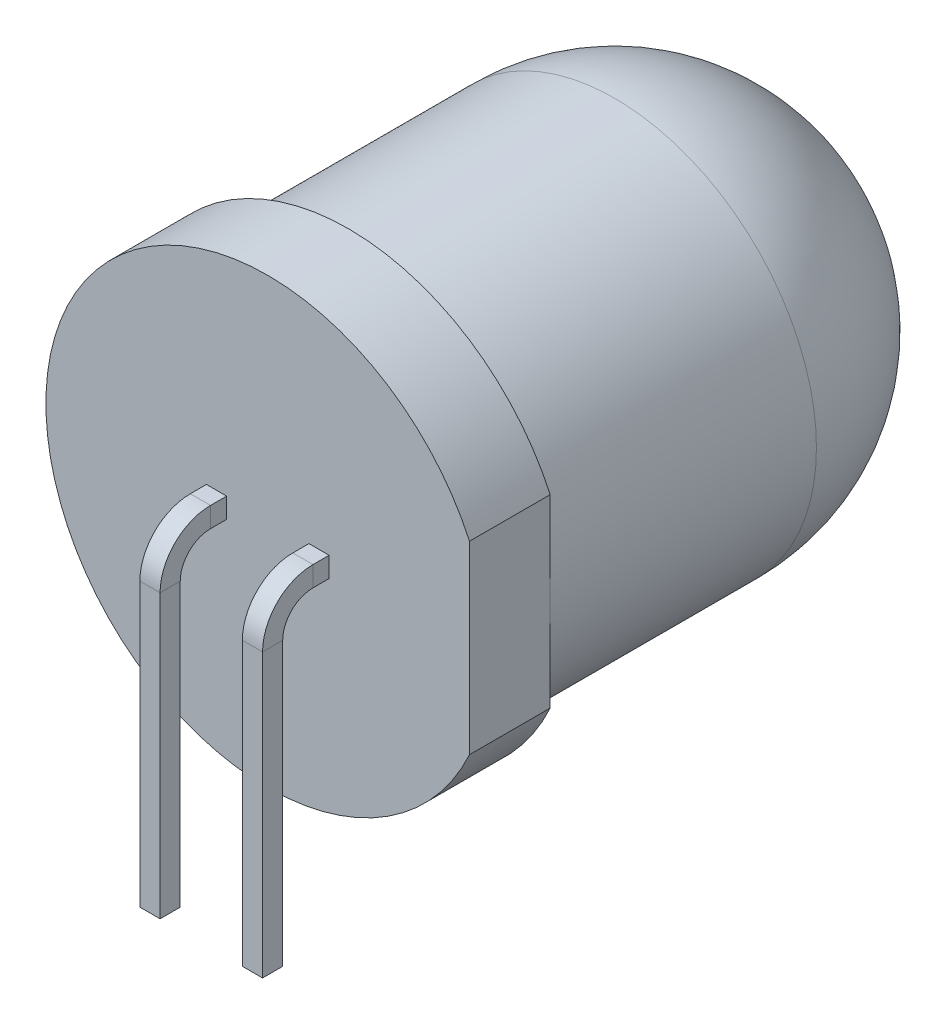
ISO-10303-21;
HEADER;
FILE_DESCRIPTION(('STEP AP214'),'2;1');
FILE_NAME('part.step','',(''),(''),'','','');
FILE_SCHEMA(('AUTOMOTIVE_DESIGN { 1 0 10303 214 1 1 1 1 }'));
ENDSEC;
DATA;
#1=APPLICATION_CONTEXT('core data for automotive mechanical design processes');
#2=APPLICATION_PROTOCOL_DEFINITION('international standard','automotive_design',2000,#1);
#3=PRODUCT_CONTEXT('',#1,'mechanical');
#4=PRODUCT('Part','Part','',(#3));
#5=PRODUCT_RELATED_PRODUCT_CATEGORY('part','',(#4));
#6=PRODUCT_DEFINITION_FORMATION('','',#4);
#7=PRODUCT_DEFINITION_CONTEXT('part definition',#1,'design');
#8=PRODUCT_DEFINITION('design','',#6,#7);
#9=PRODUCT_DEFINITION_SHAPE('','',#8);
#10=(LENGTH_UNIT() NAMED_UNIT(*) SI_UNIT(.MILLI.,.METRE.));
#11=(NAMED_UNIT(*) PLANE_ANGLE_UNIT() SI_UNIT($,.RADIAN.));
#12=(NAMED_UNIT(*) SI_UNIT($,.STERADIAN.) SOLID_ANGLE_UNIT());
#13=UNCERTAINTY_MEASURE_WITH_UNIT(LENGTH_MEASURE(1.E-05),#10,'distance_accuracy_value','');
#14=(GEOMETRIC_REPRESENTATION_CONTEXT(3) GLOBAL_UNCERTAINTY_ASSIGNED_CONTEXT((#13)) GLOBAL_UNIT_ASSIGNED_CONTEXT((#10,
#11,#12)) REPRESENTATION_CONTEXT('',''));
#15=CARTESIAN_POINT('',(0.,0.,0.));
#16=DIRECTION('',(0.,0.,1.));
#17=DIRECTION('',(1.,0.,0.));
#18=AXIS2_PLACEMENT_3D('',#15,#16,#17);
#19=CARTESIAN_POINT('',(5.5,0.,0.));
#20=DIRECTION('',(0.,0.,1.));
#21=DIRECTION('',(1.,0.,0.));
#22=AXIS2_PLACEMENT_3D('',#19,#20,#21);
#23=PLANE('',#22);
#24=DIRECTION('',(-1.,0.,0.));
#25=VECTOR('',#24,1.);
#26=CARTESIAN_POINT('',(-1.02,0.25,0.));
#27=LINE('',#26,#25);
#28=CARTESIAN_POINT('',(-1.02,0.25,0.));
#29=VERTEX_POINT('',#28);
#30=CARTESIAN_POINT('',(-1.52,0.25,0.));
#31=VERTEX_POINT('',#30);
#32=EDGE_CURVE('E49',#29,#31,#27,.T.);
#33=ORIENTED_EDGE('',*,*,#32,.F.);
#34=DIRECTION('',(0.,1.,0.));
#35=VECTOR('',#34,1.);
#36=CARTESIAN_POINT('',(-1.02,0.25,0.));
#37=LINE('',#36,#35);
#38=CARTESIAN_POINT('',(-1.02,-0.25,0.));
#39=VERTEX_POINT('',#38);
#40=EDGE_CURVE('E53',#39,#29,#37,.T.);
#41=ORIENTED_EDGE('',*,*,#40,.F.);
#42=DIRECTION('',(1.,0.,0.));
#43=VECTOR('',#42,1.);
#44=CARTESIAN_POINT('',(-1.02,-0.25,0.));
#45=LINE('',#44,#43);
#46=CARTESIAN_POINT('',(-1.52,-0.25,0.));
#47=VERTEX_POINT('',#46);
#48=EDGE_CURVE('E192',#47,#39,#45,.T.);
#49=ORIENTED_EDGE('',*,*,#48,.F.);
#50=DIRECTION('',(0.,-1.,0.));
#51=VECTOR('',#50,1.);
#52=CARTESIAN_POINT('',(-1.52,0.25,0.));
#53=LINE('',#52,#51);
#54=EDGE_CURVE('E210',#31,#47,#53,.T.);
#55=ORIENTED_EDGE('',*,*,#54,.F.);
#56=EDGE_LOOP('',(#33,#41,#49,#55));
#57=FACE_BOUND('',#56,.T.);
#58=DIRECTION('',(0.,1.,0.));
#59=VECTOR('',#58,1.);
#60=CARTESIAN_POINT('',(1.52,0.25,0.));
#61=LINE('',#60,#59);
#62=CARTESIAN_POINT('',(1.52,-0.25,0.));
#63=VERTEX_POINT('',#62);
#64=CARTESIAN_POINT('',(1.52,0.25,0.));
#65=VERTEX_POINT('',#64);
#66=EDGE_CURVE('E284',#63,#65,#61,.T.);
#67=ORIENTED_EDGE('',*,*,#66,.F.);
#68=DIRECTION('',(1.,0.,0.));
#69=VECTOR('',#68,1.);
#70=CARTESIAN_POINT('',(1.02,-0.25,0.));
#71=LINE('',#70,#69);
#72=CARTESIAN_POINT('',(1.02,-0.25,0.));
#73=VERTEX_POINT('',#72);
#74=EDGE_CURVE('E249',#73,#63,#71,.T.);
#75=ORIENTED_EDGE('',*,*,#74,.F.);
#76=DIRECTION('',(0.,-1.,0.));
#77=VECTOR('',#76,1.);
#78=CARTESIAN_POINT('',(1.02,0.25,0.));
#79=LINE('',#78,#77);
#80=CARTESIAN_POINT('',(1.02,0.25,0.));
#81=VERTEX_POINT('',#80);
#82=EDGE_CURVE('E246',#81,#73,#79,.T.);
#83=ORIENTED_EDGE('',*,*,#82,.F.);
#84=DIRECTION('',(-1.,0.,0.));
#85=VECTOR('',#84,1.);
#86=CARTESIAN_POINT('',(1.02,0.25,0.));
#87=LINE('',#86,#85);
#88=EDGE_CURVE('E260',#65,#81,#87,.T.);
#89=ORIENTED_EDGE('',*,*,#88,.F.);
#90=EDGE_LOOP('',(#67,#75,#83,#89));
#91=FACE_BOUND('',#90,.T.);
#92=DIRECTION('',(0.,-1.,0.));
#93=VECTOR('',#92,1.);
#94=CARTESIAN_POINT('',(5.,2.29128784747792,0.));
#95=LINE('',#94,#93);
#96=CARTESIAN_POINT('',(5.,2.29128784747792,0.));
#97=VERTEX_POINT('',#96);
#98=CARTESIAN_POINT('',(5.,-2.29128784747792,0.));
#99=VERTEX_POINT('',#98);
#100=EDGE_CURVE('E326',#97,#99,#95,.T.);
#101=ORIENTED_EDGE('',*,*,#100,.F.);
#102=CARTESIAN_POINT('',(0.,0.,0.));
#103=DIRECTION('',(0.,0.,1.));
#104=DIRECTION('',(1.,0.,0.));
#105=AXIS2_PLACEMENT_3D('',#102,#103,#104);
#106=CIRCLE('',#105,5.5);
#107=EDGE_CURVE('E331',#97,#99,#106,.T.);
#108=ORIENTED_EDGE('',*,*,#107,.T.);
#109=EDGE_LOOP('',(#101,#108));
#110=FACE_BOUND('',#109,.T.);
#111=ADVANCED_FACE('F35',(#57,#91,#110),#23,.T.);
#112=CARTESIAN_POINT('',(0.,0.,-8.6));
#113=DIRECTION('',(0.,0.,1.));
#114=DIRECTION('',(1.,0.,0.));
#115=AXIS2_PLACEMENT_3D('',#112,#113,#114);
#116=SPHERICAL_SURFACE('',#115,5.);
#117=CARTESIAN_POINT('',(0.,0.,-8.6));
#118=DIRECTION('',(0.,0.,1.));
#119=DIRECTION('',(1.,0.,0.));
#120=AXIS2_PLACEMENT_3D('',#117,#118,#119);
#121=CIRCLE('',#120,5.);
#122=CARTESIAN_POINT('',(5.,0.,-8.6));
#123=VERTEX_POINT('',#122);
#124=EDGE_CURVE('E340',#123,#123,#121,.T.);
#125=ORIENTED_EDGE('',*,*,#124,.F.);
#126=EDGE_LOOP('',(#125));
#127=FACE_BOUND('',#126,.T.);
#128=ADVANCED_FACE('F360',(#127),#116,.T.);
#129=CARTESIAN_POINT('',(0.,0.,0.));
#130=DIRECTION('',(0.,0.,1.));
#131=DIRECTION('',(1.,0.,0.));
#132=AXIS2_PLACEMENT_3D('',#129,#130,#131);
#133=CYLINDRICAL_SURFACE('',#132,5.);
#134=ORIENTED_EDGE('',*,*,#124,.T.);
#135=EDGE_LOOP('',(#134));
#136=FACE_BOUND('',#135,.T.);
#137=CARTESIAN_POINT('',(0.,0.,-2.));
#138=DIRECTION('',(0.,0.,1.));
#139=DIRECTION('',(1.,0.,0.));
#140=AXIS2_PLACEMENT_3D('',#137,#138,#139);
#141=CIRCLE('',#140,5.);
#142=CARTESIAN_POINT('',(5.,0.,-2.));
#143=VERTEX_POINT('',#142);
#144=EDGE_CURVE('E337',#143,#143,#141,.T.);
#145=ORIENTED_EDGE('',*,*,#144,.F.);
#146=EDGE_LOOP('',(#145));
#147=FACE_BOUND('',#146,.T.);
#148=ADVANCED_FACE('F358',(#136,#147),#133,.T.);
#149=CARTESIAN_POINT('',(5.,0.,-2.));
#150=DIRECTION('',(0.,0.,-1.));
#151=DIRECTION('',(-1.,0.,0.));
#152=AXIS2_PLACEMENT_3D('',#149,#150,#151);
#153=PLANE('',#152);
#154=DIRECTION('',(0.,1.,0.));
#155=VECTOR('',#154,1.);
#156=CARTESIAN_POINT('',(5.,0.,-2.));
#157=LINE('',#156,#155);
#158=CARTESIAN_POINT('',(5.,-2.29128784747792,-2.));
#159=VERTEX_POINT('',#158);
#160=EDGE_CURVE('E330',#159,#143,#157,.T.);
#161=ORIENTED_EDGE('',*,*,#160,.F.);
#162=CARTESIAN_POINT('',(0.,0.,-2.));
#163=DIRECTION('',(0.,0.,1.));
#164=DIRECTION('',(1.,0.,0.));
#165=AXIS2_PLACEMENT_3D('',#162,#163,#164);
#166=CIRCLE('',#165,5.5);
#167=CARTESIAN_POINT('',(5.,2.29128784747792,-2.));
#168=VERTEX_POINT('',#167);
#169=EDGE_CURVE('E334',#168,#159,#166,.T.);
#170=ORIENTED_EDGE('',*,*,#169,.F.);
#171=EDGE_CURVE('E328',#143,#168,#157,.T.);
#172=ORIENTED_EDGE('',*,*,#171,.F.);
#173=ORIENTED_EDGE('',*,*,#144,.T.);
#174=EDGE_LOOP('',(#161,#170,#172,#173));
#175=FACE_BOUND('',#174,.T.);
#176=ADVANCED_FACE('F355',(#175),#153,.T.);
#177=CARTESIAN_POINT('',(0.,0.,0.));
#178=DIRECTION('',(0.,0.,1.));
#179=DIRECTION('',(1.,0.,0.));
#180=AXIS2_PLACEMENT_3D('',#177,#178,#179);
#181=CYLINDRICAL_SURFACE('',#180,5.5);
#182=DIRECTION('',(0.,0.,1.));
#183=VECTOR('',#182,1.);
#184=CARTESIAN_POINT('',(5.,-2.29128784747792,0.));
#185=LINE('',#184,#183);
#186=EDGE_CURVE('E11',#99,#159,#185,.F.);
#187=ORIENTED_EDGE('',*,*,#186,.F.);
#188=ORIENTED_EDGE('',*,*,#107,.F.);
#189=DIRECTION('',(0.,0.,1.));
#190=VECTOR('',#189,1.);
#191=CARTESIAN_POINT('',(5.,2.29128784747792,0.));
#192=LINE('',#191,#190);
#193=EDGE_CURVE('E42',#168,#97,#192,.T.);
#194=ORIENTED_EDGE('',*,*,#193,.F.);
#195=ORIENTED_EDGE('',*,*,#169,.T.);
#196=EDGE_LOOP('',(#187,#188,#194,#195));
#197=FACE_BOUND('',#196,.T.);
#198=ADVANCED_FACE('F352',(#197),#181,.T.);
#199=CARTESIAN_POINT('',(5.,2.29128784747792,-13.6));
#200=DIRECTION('',(-1.,0.,0.));
#201=DIRECTION('',(0.,0.,1.));
#202=AXIS2_PLACEMENT_3D('',#199,#200,#201);
#203=PLANE('',#202);
#204=ORIENTED_EDGE('',*,*,#160,.T.);
#205=ORIENTED_EDGE('',*,*,#171,.T.);
#206=ORIENTED_EDGE('',*,*,#193,.T.);
#207=ORIENTED_EDGE('',*,*,#100,.T.);
#208=ORIENTED_EDGE('',*,*,#186,.T.);
#209=EDGE_LOOP('',(#204,#205,#206,#207,#208));
#210=FACE_BOUND('',#209,.T.);
#211=ADVANCED_FACE('F345',(#210),#203,.F.);
#212=CARTESIAN_POINT('',(0.,-8.,1.4));
#213=DIRECTION('',(0.,-1.,0.));
#214=DIRECTION('',(1.,0.,0.));
#215=AXIS2_PLACEMENT_3D('',#212,#213,#214);
#216=PLANE('',#215);
#217=DIRECTION('',(0.,0.,1.));
#218=VECTOR('',#217,1.);
#219=CARTESIAN_POINT('',(1.52,-8.,1.65));
#220=LINE('',#219,#218);
#221=CARTESIAN_POINT('',(1.52,-8.,1.15));
#222=VERTEX_POINT('',#221);
#223=CARTESIAN_POINT('',(1.52,-8.,1.65));
#224=VERTEX_POINT('',#223);
#225=EDGE_CURVE('E301',#222,#224,#220,.T.);
#226=ORIENTED_EDGE('',*,*,#225,.T.);
#227=DIRECTION('',(-1.,0.,0.));
#228=VECTOR('',#227,1.);
#229=CARTESIAN_POINT('',(1.02,-8.,1.65));
#230=LINE('',#229,#228);
#231=CARTESIAN_POINT('',(1.02,-8.,1.65));
#232=VERTEX_POINT('',#231);
#233=EDGE_CURVE('E318',#224,#232,#230,.T.);
#234=ORIENTED_EDGE('',*,*,#233,.T.);
#235=DIRECTION('',(0.,0.,-1.));
#236=VECTOR('',#235,1.);
#237=CARTESIAN_POINT('',(1.02,-8.,1.65));
#238=LINE('',#237,#236);
#239=CARTESIAN_POINT('',(1.02,-8.,1.15));
#240=VERTEX_POINT('',#239);
#241=EDGE_CURVE('E272',#232,#240,#238,.T.);
#242=ORIENTED_EDGE('',*,*,#241,.T.);
#243=DIRECTION('',(1.,0.,0.));
#244=VECTOR('',#243,1.);
#245=CARTESIAN_POINT('',(1.02,-8.,1.15));
#246=LINE('',#245,#244);
#247=EDGE_CURVE('E278',#240,#222,#246,.T.);
#248=ORIENTED_EDGE('',*,*,#247,.T.);
#249=EDGE_LOOP('',(#226,#234,#242,#248));
#250=FACE_BOUND('',#249,.T.);
#251=ADVANCED_FACE('F426',(#250),#216,.T.);
#252=CARTESIAN_POINT('',(1.02,0.25,0.));
#253=DIRECTION('',(-1.,0.,0.));
#254=DIRECTION('',(0.,0.,1.));
#255=AXIS2_PLACEMENT_3D('',#252,#253,#254);
#256=PLANE('',#255);
#257=DIRECTION('',(0.,0.,1.));
#258=VECTOR('',#257,1.);
#259=CARTESIAN_POINT('',(1.02,-0.25,0.));
#260=LINE('',#259,#258);
#261=CARTESIAN_POINT('',(1.02,-0.25,0.4));
#262=VERTEX_POINT('',#261);
#263=EDGE_CURVE('E253',#73,#262,#260,.T.);
#264=ORIENTED_EDGE('',*,*,#263,.T.);
#265=DIRECTION('',(0.,-1.,0.));
#266=VECTOR('',#265,1.);
#267=CARTESIAN_POINT('',(1.02,0.25,0.4));
#268=LINE('',#267,#266);
#269=CARTESIAN_POINT('',(1.02,0.25,0.4));
#270=VERTEX_POINT('',#269);
#271=EDGE_CURVE('E250',#270,#262,#268,.T.);
#272=ORIENTED_EDGE('',*,*,#271,.F.);
#273=DIRECTION('',(0.,0.,1.));
#274=VECTOR('',#273,1.);
#275=CARTESIAN_POINT('',(1.02,0.25,0.));
#276=LINE('',#275,#274);
#277=EDGE_CURVE('E254',#81,#270,#276,.T.);
#278=ORIENTED_EDGE('',*,*,#277,.F.);
#279=ORIENTED_EDGE('',*,*,#82,.T.);
#280=EDGE_LOOP('',(#264,#272,#278,#279));
#281=FACE_BOUND('',#280,.T.);
#282=ADVANCED_FACE('F405',(#281),#256,.T.);
#283=CARTESIAN_POINT('',(1.02,-0.25,0.));
#284=DIRECTION('',(0.,-1.,0.));
#285=DIRECTION('',(0.,0.,-1.));
#286=AXIS2_PLACEMENT_3D('',#283,#284,#285);
#287=PLANE('',#286);
#288=DIRECTION('',(0.,0.,1.));
#289=VECTOR('',#288,1.);
#290=CARTESIAN_POINT('',(1.52,-0.25,0.));
#291=LINE('',#290,#289);
#292=CARTESIAN_POINT('',(1.52,-0.25,0.4));
#293=VERTEX_POINT('',#292);
#294=EDGE_CURVE('E287',#63,#293,#291,.T.);
#295=ORIENTED_EDGE('',*,*,#294,.T.);
#296=DIRECTION('',(1.,0.,0.));
#297=VECTOR('',#296,1.);
#298=CARTESIAN_POINT('',(1.02,-0.25,0.4));
#299=LINE('',#298,#297);
#300=EDGE_CURVE('E257',#262,#293,#299,.T.);
#301=ORIENTED_EDGE('',*,*,#300,.F.);
#302=ORIENTED_EDGE('',*,*,#263,.F.);
#303=ORIENTED_EDGE('',*,*,#74,.T.);
#304=EDGE_LOOP('',(#295,#301,#302,#303));
#305=FACE_BOUND('',#304,.T.);
#306=ADVANCED_FACE('F378',(#305),#287,.T.);
#307=CARTESIAN_POINT('',(1.52,0.25,0.));
#308=DIRECTION('',(1.,0.,0.));
#309=DIRECTION('',(0.,0.,-1.));
#310=AXIS2_PLACEMENT_3D('',#307,#308,#309);
#311=PLANE('',#310);
#312=DIRECTION('',(0.,0.,1.));
#313=VECTOR('',#312,1.);
#314=CARTESIAN_POINT('',(1.52,0.25,0.));
#315=LINE('',#314,#313);
#316=CARTESIAN_POINT('',(1.52,0.25,0.4));
#317=VERTEX_POINT('',#316);
#318=EDGE_CURVE('E306',#65,#317,#315,.T.);
#319=ORIENTED_EDGE('',*,*,#318,.T.);
#320=DIRECTION('',(0.,1.,0.));
#321=VECTOR('',#320,1.);
#322=CARTESIAN_POINT('',(1.52,0.25,0.4));
#323=LINE('',#322,#321);
#324=EDGE_CURVE('E290',#293,#317,#323,.T.);
#325=ORIENTED_EDGE('',*,*,#324,.F.);
#326=ORIENTED_EDGE('',*,*,#294,.F.);
#327=ORIENTED_EDGE('',*,*,#66,.T.);
#328=EDGE_LOOP('',(#319,#325,#326,#327));
#329=FACE_BOUND('',#328,.T.);
#330=ADVANCED_FACE('F381',(#329),#311,.T.);
#331=CARTESIAN_POINT('',(1.02,0.25,0.));
#332=DIRECTION('',(0.,1.,0.));
#333=DIRECTION('',(0.,0.,1.));
#334=AXIS2_PLACEMENT_3D('',#331,#332,#333);
#335=PLANE('',#334);
#336=DIRECTION('',(-1.,0.,0.));
#337=VECTOR('',#336,1.);
#338=CARTESIAN_POINT('',(1.02,0.25,0.4));
#339=LINE('',#338,#337);
#340=EDGE_CURVE('E271',#317,#270,#339,.T.);
#341=ORIENTED_EDGE('',*,*,#340,.F.);
#342=ORIENTED_EDGE('',*,*,#318,.F.);
#343=ORIENTED_EDGE('',*,*,#88,.T.);
#344=ORIENTED_EDGE('',*,*,#277,.T.);
#345=EDGE_LOOP('',(#341,#342,#343,#344));
#346=FACE_BOUND('',#345,.T.);
#347=ADVANCED_FACE('F406',(#346),#335,.T.);
#348=CARTESIAN_POINT('',(1.02,0.25,0.4));
#349=DIRECTION('',(-1.,0.,0.));
#350=DIRECTION('',(0.,0.,1.));
#351=AXIS2_PLACEMENT_3D('',#348,#349,#350);
#352=PLANE('',#351);
#353=CARTESIAN_POINT('',(1.02,-1.,0.4));
#354=DIRECTION('',(1.,0.,0.));
#355=DIRECTION('',(0.,1.,0.));
#356=AXIS2_PLACEMENT_3D('',#353,#354,#355);
#357=CIRCLE('',#356,0.75);
#358=CARTESIAN_POINT('',(1.02,-1.,1.15));
#359=VERTEX_POINT('',#358);
#360=EDGE_CURVE('E264',#262,#359,#357,.T.);
#361=ORIENTED_EDGE('',*,*,#360,.T.);
#362=DIRECTION('',(0.,0.,-1.));
#363=VECTOR('',#362,1.);
#364=CARTESIAN_POINT('',(1.02,-1.,1.65));
#365=LINE('',#364,#363);
#366=CARTESIAN_POINT('',(1.02,-1.,1.65));
#367=VERTEX_POINT('',#366);
#368=EDGE_CURVE('E261',#367,#359,#365,.T.);
#369=ORIENTED_EDGE('',*,*,#368,.F.);
#370=CARTESIAN_POINT('',(1.02,-1.,0.4));
#371=DIRECTION('',(1.,0.,0.));
#372=DIRECTION('',(0.,1.,0.));
#373=AXIS2_PLACEMENT_3D('',#370,#371,#372);
#374=CIRCLE('',#373,1.25);
#375=EDGE_CURVE('E265',#270,#367,#374,.T.);
#376=ORIENTED_EDGE('',*,*,#375,.F.);
#377=ORIENTED_EDGE('',*,*,#271,.T.);
#378=EDGE_LOOP('',(#361,#369,#376,#377));
#379=FACE_BOUND('',#378,.T.);
#380=ADVANCED_FACE('F396',(#379),#352,.T.);
#381=CARTESIAN_POINT('',(1.27,-1.,0.4));
#382=DIRECTION('',(1.,0.,0.));
#383=DIRECTION('',(0.,0.,-1.));
#384=AXIS2_PLACEMENT_3D('',#381,#382,#383);
#385=CYLINDRICAL_SURFACE('',#384,0.75);
#386=CARTESIAN_POINT('',(1.52,-1.,0.4));
#387=DIRECTION('',(1.,0.,0.));
#388=DIRECTION('',(0.,1.,0.));
#389=AXIS2_PLACEMENT_3D('',#386,#387,#388);
#390=CIRCLE('',#389,0.75);
#391=CARTESIAN_POINT('',(1.52,-1.,1.15));
#392=VERTEX_POINT('',#391);
#393=EDGE_CURVE('E293',#293,#392,#390,.T.);
#394=ORIENTED_EDGE('',*,*,#393,.T.);
#395=DIRECTION('',(1.,0.,0.));
#396=VECTOR('',#395,1.);
#397=CARTESIAN_POINT('',(1.02,-1.,1.15));
#398=LINE('',#397,#396);
#399=EDGE_CURVE('E268',#359,#392,#398,.T.);
#400=ORIENTED_EDGE('',*,*,#399,.F.);
#401=ORIENTED_EDGE('',*,*,#360,.F.);
#402=ORIENTED_EDGE('',*,*,#300,.T.);
#403=EDGE_LOOP('',(#394,#400,#401,#402));
#404=FACE_BOUND('',#403,.T.);
#405=ADVANCED_FACE('F387',(#404),#385,.F.);
#406=CARTESIAN_POINT('',(1.52,0.25,0.4));
#407=DIRECTION('',(1.,0.,0.));
#408=DIRECTION('',(0.,0.,-1.));
#409=AXIS2_PLACEMENT_3D('',#406,#407,#408);
#410=PLANE('',#409);
#411=CARTESIAN_POINT('',(1.52,-1.,0.4));
#412=DIRECTION('',(1.,0.,0.));
#413=DIRECTION('',(0.,1.,0.));
#414=AXIS2_PLACEMENT_3D('',#411,#412,#413);
#415=CIRCLE('',#414,1.25);
#416=CARTESIAN_POINT('',(1.52,-1.,1.65));
#417=VERTEX_POINT('',#416);
#418=EDGE_CURVE('E311',#317,#417,#415,.T.);
#419=ORIENTED_EDGE('',*,*,#418,.T.);
#420=DIRECTION('',(0.,0.,1.));
#421=VECTOR('',#420,1.);
#422=CARTESIAN_POINT('',(1.52,-1.,1.65));
#423=LINE('',#422,#421);
#424=EDGE_CURVE('E296',#392,#417,#423,.T.);
#425=ORIENTED_EDGE('',*,*,#424,.F.);
#426=ORIENTED_EDGE('',*,*,#393,.F.);
#427=ORIENTED_EDGE('',*,*,#324,.T.);
#428=EDGE_LOOP('',(#419,#425,#426,#427));
#429=FACE_BOUND('',#428,.T.);
#430=ADVANCED_FACE('F383',(#429),#410,.T.);
#431=CARTESIAN_POINT('',(1.27,-1.,0.4));
#432=DIRECTION('',(1.,0.,0.));
#433=DIRECTION('',(0.,0.,-1.));
#434=AXIS2_PLACEMENT_3D('',#431,#432,#433);
#435=CYLINDRICAL_SURFACE('',#434,1.25);
#436=DIRECTION('',(-1.,0.,0.));
#437=VECTOR('',#436,1.);
#438=CARTESIAN_POINT('',(1.02,-1.,1.65));
#439=LINE('',#438,#437);
#440=EDGE_CURVE('E281',#417,#367,#439,.T.);
#441=ORIENTED_EDGE('',*,*,#440,.F.);
#442=ORIENTED_EDGE('',*,*,#418,.F.);
#443=ORIENTED_EDGE('',*,*,#340,.T.);
#444=ORIENTED_EDGE('',*,*,#375,.T.);
#445=EDGE_LOOP('',(#441,#442,#443,#444));
#446=FACE_BOUND('',#445,.T.);
#447=ADVANCED_FACE('F399',(#446),#435,.T.);
#448=CARTESIAN_POINT('',(1.02,-1.,1.65));
#449=DIRECTION('',(-1.,0.,0.));
#450=DIRECTION('',(0.,0.,1.));
#451=AXIS2_PLACEMENT_3D('',#448,#449,#450);
#452=PLANE('',#451);
#453=DIRECTION('',(0.,-1.,0.));
#454=VECTOR('',#453,1.);
#455=CARTESIAN_POINT('',(1.02,-1.,1.15));
#456=LINE('',#455,#454);
#457=EDGE_CURVE('E274',#359,#240,#456,.T.);
#458=ORIENTED_EDGE('',*,*,#457,.T.);
#459=ORIENTED_EDGE('',*,*,#241,.F.);
#460=DIRECTION('',(0.,-1.,0.));
#461=VECTOR('',#460,1.);
#462=CARTESIAN_POINT('',(1.02,-1.,1.65));
#463=LINE('',#462,#461);
#464=EDGE_CURVE('E275',#367,#232,#463,.T.);
#465=ORIENTED_EDGE('',*,*,#464,.F.);
#466=ORIENTED_EDGE('',*,*,#368,.T.);
#467=EDGE_LOOP('',(#458,#459,#465,#466));
#468=FACE_BOUND('',#467,.T.);
#469=ADVANCED_FACE('F393',(#468),#452,.T.);
#470=CARTESIAN_POINT('',(1.02,-1.,1.15));
#471=DIRECTION('',(0.,0.,-1.));
#472=DIRECTION('',(0.,1.,0.));
#473=AXIS2_PLACEMENT_3D('',#470,#471,#472);
#474=PLANE('',#473);
#475=DIRECTION('',(0.,-1.,0.));
#476=VECTOR('',#475,1.);
#477=CARTESIAN_POINT('',(1.52,-1.,1.15));
#478=LINE('',#477,#476);
#479=EDGE_CURVE('E298',#392,#222,#478,.T.);
#480=ORIENTED_EDGE('',*,*,#479,.T.);
#481=ORIENTED_EDGE('',*,*,#247,.F.);
#482=ORIENTED_EDGE('',*,*,#457,.F.);
#483=ORIENTED_EDGE('',*,*,#399,.T.);
#484=EDGE_LOOP('',(#480,#481,#482,#483));
#485=FACE_BOUND('',#484,.T.);
#486=ADVANCED_FACE('F389',(#485),#474,.T.);
#487=CARTESIAN_POINT('',(1.52,-1.,1.65));
#488=DIRECTION('',(1.,0.,0.));
#489=DIRECTION('',(0.,0.,-1.));
#490=AXIS2_PLACEMENT_3D('',#487,#488,#489);
#491=PLANE('',#490);
#492=DIRECTION('',(0.,-1.,0.));
#493=VECTOR('',#492,1.);
#494=CARTESIAN_POINT('',(1.52,-1.,1.65));
#495=LINE('',#494,#493);
#496=EDGE_CURVE('E315',#417,#224,#495,.T.);
#497=ORIENTED_EDGE('',*,*,#496,.T.);
#498=ORIENTED_EDGE('',*,*,#225,.F.);
#499=ORIENTED_EDGE('',*,*,#479,.F.);
#500=ORIENTED_EDGE('',*,*,#424,.T.);
#501=EDGE_LOOP('',(#497,#498,#499,#500));
#502=FACE_BOUND('',#501,.T.);
#503=ADVANCED_FACE('F417',(#502),#491,.T.);
#504=CARTESIAN_POINT('',(1.02,-1.,1.65));
#505=DIRECTION('',(0.,0.,1.));
#506=DIRECTION('',(0.,-1.,0.));
#507=AXIS2_PLACEMENT_3D('',#504,#505,#506);
#508=PLANE('',#507);
#509=ORIENTED_EDGE('',*,*,#233,.F.);
#510=ORIENTED_EDGE('',*,*,#496,.F.);
#511=ORIENTED_EDGE('',*,*,#440,.T.);
#512=ORIENTED_EDGE('',*,*,#464,.T.);
#513=EDGE_LOOP('',(#509,#510,#511,#512));
#514=FACE_BOUND('',#513,.T.);
#515=ADVANCED_FACE('F421',(#514),#508,.T.);
#516=CARTESIAN_POINT('',(0.,-8.,1.4));
#517=DIRECTION('',(0.,-1.,0.));
#518=DIRECTION('',(1.,0.,0.));
#519=AXIS2_PLACEMENT_3D('',#516,#517,#518);
#520=PLANE('',#519);
#521=DIRECTION('',(-1.,0.,0.));
#522=VECTOR('',#521,1.);
#523=CARTESIAN_POINT('',(-1.02,-8.,1.65));
#524=LINE('',#523,#522);
#525=CARTESIAN_POINT('',(-1.02,-8.,1.65));
#526=VERTEX_POINT('',#525);
#527=CARTESIAN_POINT('',(-1.52,-8.,1.65));
#528=VERTEX_POINT('',#527);
#529=EDGE_CURVE('E200',#526,#528,#524,.T.);
#530=ORIENTED_EDGE('',*,*,#529,.T.);
#531=DIRECTION('',(0.,0.,-1.));
#532=VECTOR('',#531,1.);
#533=CARTESIAN_POINT('',(-1.52,-8.,1.65));
#534=LINE('',#533,#532);
#535=CARTESIAN_POINT('',(-1.52,-8.,1.15));
#536=VERTEX_POINT('',#535);
#537=EDGE_CURVE('E206',#528,#536,#534,.T.);
#538=ORIENTED_EDGE('',*,*,#537,.T.);
#539=DIRECTION('',(1.,0.,0.));
#540=VECTOR('',#539,1.);
#541=CARTESIAN_POINT('',(-1.02,-8.,1.15));
#542=LINE('',#541,#540);
#543=CARTESIAN_POINT('',(-1.02,-8.,1.15));
#544=VERTEX_POINT('',#543);
#545=EDGE_CURVE('E230',#536,#544,#542,.T.);
#546=ORIENTED_EDGE('',*,*,#545,.T.);
#547=DIRECTION('',(0.,0.,1.));
#548=VECTOR('',#547,1.);
#549=CARTESIAN_POINT('',(-1.02,-8.,1.65));
#550=LINE('',#549,#548);
#551=EDGE_CURVE('E241',#544,#526,#550,.T.);
#552=ORIENTED_EDGE('',*,*,#551,.T.);
#553=EDGE_LOOP('',(#530,#538,#546,#552));
#554=FACE_BOUND('',#553,.T.);
#555=ADVANCED_FACE('F424',(#554),#520,.T.);
#556=CARTESIAN_POINT('',(-1.02,0.25,0.));
#557=DIRECTION('',(0.,1.,0.));
#558=DIRECTION('',(-1.,0.,0.));
#559=AXIS2_PLACEMENT_3D('',#556,#557,#558);
#560=PLANE('',#559);
#561=DIRECTION('',(0.,0.,1.));
#562=VECTOR('',#561,1.);
#563=CARTESIAN_POINT('',(-1.52,0.25,0.));
#564=LINE('',#563,#562);
#565=CARTESIAN_POINT('',(-1.52,0.25,0.4));
#566=VERTEX_POINT('',#565);
#567=EDGE_CURVE('E188',#31,#566,#564,.T.);
#568=ORIENTED_EDGE('',*,*,#567,.T.);
#569=DIRECTION('',(-1.,0.,0.));
#570=VECTOR('',#569,1.);
#571=CARTESIAN_POINT('',(-1.02,0.25,0.4));
#572=LINE('',#571,#570);
#573=CARTESIAN_POINT('',(-1.02,0.25,0.4));
#574=VERTEX_POINT('',#573);
#575=EDGE_CURVE('E165',#574,#566,#572,.T.);
#576=ORIENTED_EDGE('',*,*,#575,.F.);
#577=DIRECTION('',(0.,0.,1.));
#578=VECTOR('',#577,1.);
#579=CARTESIAN_POINT('',(-1.02,0.25,0.));
#580=LINE('',#579,#578);
#581=EDGE_CURVE('E186',#29,#574,#580,.T.);
#582=ORIENTED_EDGE('',*,*,#581,.F.);
#583=ORIENTED_EDGE('',*,*,#32,.T.);
#584=EDGE_LOOP('',(#568,#576,#582,#583));
#585=FACE_BOUND('',#584,.T.);
#586=ADVANCED_FACE('F185',(#585),#560,.T.);
#587=CARTESIAN_POINT('',(-1.52,0.25,0.));
#588=DIRECTION('',(-1.,0.,0.));
#589=DIRECTION('',(0.,0.,1.));
#590=AXIS2_PLACEMENT_3D('',#587,#588,#589);
#591=PLANE('',#590);
#592=DIRECTION('',(0.,0.,1.));
#593=VECTOR('',#592,1.);
#594=CARTESIAN_POINT('',(-1.52,-0.25,0.));
#595=LINE('',#594,#593);
#596=CARTESIAN_POINT('',(-1.52,-0.25,0.4));
#597=VERTEX_POINT('',#596);
#598=EDGE_CURVE('E216',#47,#597,#595,.T.);
#599=ORIENTED_EDGE('',*,*,#598,.T.);
#600=DIRECTION('',(0.,-1.,0.));
#601=VECTOR('',#600,1.);
#602=CARTESIAN_POINT('',(-1.52,0.25,0.4));
#603=LINE('',#602,#601);
#604=EDGE_CURVE('E213',#566,#597,#603,.T.);
#605=ORIENTED_EDGE('',*,*,#604,.F.);
#606=ORIENTED_EDGE('',*,*,#567,.F.);
#607=ORIENTED_EDGE('',*,*,#54,.T.);
#608=EDGE_LOOP('',(#599,#605,#606,#607));
#609=FACE_BOUND('',#608,.T.);
#610=ADVANCED_FACE('F541',(#609),#591,.T.);
#611=CARTESIAN_POINT('',(-1.02,-0.25,0.));
#612=DIRECTION('',(0.,-1.,0.));
#613=DIRECTION('',(1.,0.,0.));
#614=AXIS2_PLACEMENT_3D('',#611,#612,#613);
#615=PLANE('',#614);
#616=DIRECTION('',(0.,0.,1.));
#617=VECTOR('',#616,1.);
#618=CARTESIAN_POINT('',(-1.02,-0.25,0.));
#619=LINE('',#618,#617);
#620=CARTESIAN_POINT('',(-1.02,-0.25,0.4));
#621=VERTEX_POINT('',#620);
#622=EDGE_CURVE('E180',#39,#621,#619,.T.);
#623=ORIENTED_EDGE('',*,*,#622,.T.);
#624=DIRECTION('',(1.,0.,0.));
#625=VECTOR('',#624,1.);
#626=CARTESIAN_POINT('',(-1.02,-0.25,0.4));
#627=LINE('',#626,#625);
#628=EDGE_CURVE('E219',#597,#621,#627,.T.);
#629=ORIENTED_EDGE('',*,*,#628,.F.);
#630=ORIENTED_EDGE('',*,*,#598,.F.);
#631=ORIENTED_EDGE('',*,*,#48,.T.);
#632=EDGE_LOOP('',(#623,#629,#630,#631));
#633=FACE_BOUND('',#632,.T.);
#634=ADVANCED_FACE('F550',(#633),#615,.T.);
#635=CARTESIAN_POINT('',(-1.02,0.25,0.));
#636=DIRECTION('',(1.,0.,0.));
#637=DIRECTION('',(0.,0.,-1.));
#638=AXIS2_PLACEMENT_3D('',#635,#636,#637);
#639=PLANE('',#638);
#640=DIRECTION('',(0.,1.,0.));
#641=VECTOR('',#640,1.);
#642=CARTESIAN_POINT('',(-1.02,0.25,0.4));
#643=LINE('',#642,#641);
#644=EDGE_CURVE('E170',#621,#574,#643,.T.);
#645=ORIENTED_EDGE('',*,*,#644,.F.);
#646=ORIENTED_EDGE('',*,*,#622,.F.);
#647=ORIENTED_EDGE('',*,*,#40,.T.);
#648=ORIENTED_EDGE('',*,*,#581,.T.);
#649=EDGE_LOOP('',(#645,#646,#647,#648));
#650=FACE_BOUND('',#649,.T.);
#651=ADVANCED_FACE('F190',(#650),#639,.T.);
#652=CARTESIAN_POINT('',(1.27,-1.,0.4));
#653=DIRECTION('',(1.,0.,0.));
#654=DIRECTION('',(0.,0.,-1.));
#655=AXIS2_PLACEMENT_3D('',#652,#653,#654);
#656=CYLINDRICAL_SURFACE('',#655,1.25);
#657=CARTESIAN_POINT('',(-1.52,-1.,0.4));
#658=DIRECTION('',(1.,0.,0.));
#659=DIRECTION('',(0.,1.,0.));
#660=AXIS2_PLACEMENT_3D('',#657,#658,#659);
#661=CIRCLE('',#660,1.25);
#662=CARTESIAN_POINT('',(-1.52,-1.,1.65));
#663=VERTEX_POINT('',#662);
#664=EDGE_CURVE('E197',#566,#663,#661,.T.);
#665=ORIENTED_EDGE('',*,*,#664,.T.);
#666=DIRECTION('',(-1.,0.,0.));
#667=VECTOR('',#666,1.);
#668=CARTESIAN_POINT('',(-1.02,-1.,1.65));
#669=LINE('',#668,#667);
#670=CARTESIAN_POINT('',(-1.02,-1.,1.65));
#671=VERTEX_POINT('',#670);
#672=EDGE_CURVE('E167',#671,#663,#669,.T.);
#673=ORIENTED_EDGE('',*,*,#672,.F.);
#674=CARTESIAN_POINT('',(-1.02,-1.,0.4));
#675=DIRECTION('',(1.,0.,0.));
#676=DIRECTION('',(0.,1.,0.));
#677=AXIS2_PLACEMENT_3D('',#674,#675,#676);
#678=CIRCLE('',#677,1.25);
#679=EDGE_CURVE('E160',#574,#671,#678,.T.);
#680=ORIENTED_EDGE('',*,*,#679,.F.);
#681=ORIENTED_EDGE('',*,*,#575,.T.);
#682=EDGE_LOOP('',(#665,#673,#680,#681));
#683=FACE_BOUND('',#682,.T.);
#684=ADVANCED_FACE('F163',(#683),#656,.T.);
#685=CARTESIAN_POINT('',(-1.52,0.25,0.4));
#686=DIRECTION('',(-1.,0.,0.));
#687=DIRECTION('',(0.,0.,1.));
#688=AXIS2_PLACEMENT_3D('',#685,#686,#687);
#689=PLANE('',#688);
#690=CARTESIAN_POINT('',(-1.52,-1.,0.4));
#691=DIRECTION('',(1.,0.,0.));
#692=DIRECTION('',(0.,1.,0.));
#693=AXIS2_PLACEMENT_3D('',#690,#691,#692);
#694=CIRCLE('',#693,0.75);
#695=CARTESIAN_POINT('',(-1.52,-1.,1.15));
#696=VERTEX_POINT('',#695);
#697=EDGE_CURVE('E222',#597,#696,#694,.T.);
#698=ORIENTED_EDGE('',*,*,#697,.T.);
#699=DIRECTION('',(0.,0.,-1.));
#700=VECTOR('',#699,1.);
#701=CARTESIAN_POINT('',(-1.52,-1.,1.65));
#702=LINE('',#701,#700);
#703=EDGE_CURVE('E198',#663,#696,#702,.T.);
#704=ORIENTED_EDGE('',*,*,#703,.F.);
#705=ORIENTED_EDGE('',*,*,#664,.F.);
#706=ORIENTED_EDGE('',*,*,#604,.T.);
#707=EDGE_LOOP('',(#698,#704,#705,#706));
#708=FACE_BOUND('',#707,.T.);
#709=ADVANCED_FACE('F577',(#708),#689,.T.);
#710=CARTESIAN_POINT('',(1.27,-1.,0.4));
#711=DIRECTION('',(1.,0.,0.));
#712=DIRECTION('',(0.,0.,-1.));
#713=AXIS2_PLACEMENT_3D('',#710,#711,#712);
#714=CYLINDRICAL_SURFACE('',#713,0.75);
#715=CARTESIAN_POINT('',(-1.02,-1.,0.4));
#716=DIRECTION('',(1.,0.,0.));
#717=DIRECTION('',(0.,1.,0.));
#718=AXIS2_PLACEMENT_3D('',#715,#716,#717);
#719=CIRCLE('',#718,0.75);
#720=CARTESIAN_POINT('',(-1.02,-1.,1.15));
#721=VERTEX_POINT('',#720);
#722=EDGE_CURVE('E175',#621,#721,#719,.T.);
#723=ORIENTED_EDGE('',*,*,#722,.T.);
#724=DIRECTION('',(1.,0.,0.));
#725=VECTOR('',#724,1.);
#726=CARTESIAN_POINT('',(-1.02,-1.,1.15));
#727=LINE('',#726,#725);
#728=EDGE_CURVE('E225',#696,#721,#727,.T.);
#729=ORIENTED_EDGE('',*,*,#728,.F.);
#730=ORIENTED_EDGE('',*,*,#697,.F.);
#731=ORIENTED_EDGE('',*,*,#628,.T.);
#732=EDGE_LOOP('',(#723,#729,#730,#731));
#733=FACE_BOUND('',#732,.T.);
#734=ADVANCED_FACE('F586',(#733),#714,.F.);
#735=CARTESIAN_POINT('',(-1.02,0.25,0.4));
#736=DIRECTION('',(1.,0.,0.));
#737=DIRECTION('',(0.,0.,-1.));
#738=AXIS2_PLACEMENT_3D('',#735,#736,#737);
#739=PLANE('',#738);
#740=DIRECTION('',(0.,0.,1.));
#741=VECTOR('',#740,1.);
#742=CARTESIAN_POINT('',(-1.02,-1.,1.65));
#743=LINE('',#742,#741);
#744=EDGE_CURVE('E209',#721,#671,#743,.T.);
#745=ORIENTED_EDGE('',*,*,#744,.F.);
#746=ORIENTED_EDGE('',*,*,#722,.F.);
#747=ORIENTED_EDGE('',*,*,#644,.T.);
#748=ORIENTED_EDGE('',*,*,#679,.T.);
#749=EDGE_LOOP('',(#745,#746,#747,#748));
#750=FACE_BOUND('',#749,.T.);
#751=ADVANCED_FACE('F173',(#750),#739,.T.);
#752=CARTESIAN_POINT('',(-1.02,-1.,1.65));
#753=DIRECTION('',(0.,0.,1.));
#754=DIRECTION('',(1.,0.,0.));
#755=AXIS2_PLACEMENT_3D('',#752,#753,#754);
#756=PLANE('',#755);
#757=DIRECTION('',(0.,-1.,0.));
#758=VECTOR('',#757,1.);
#759=CARTESIAN_POINT('',(-1.52,-1.,1.65));
#760=LINE('',#759,#758);
#761=EDGE_CURVE('E202',#663,#528,#760,.T.);
#762=ORIENTED_EDGE('',*,*,#761,.T.);
#763=ORIENTED_EDGE('',*,*,#529,.F.);
#764=DIRECTION('',(0.,-1.,0.));
#765=VECTOR('',#764,1.);
#766=CARTESIAN_POINT('',(-1.02,-1.,1.65));
#767=LINE('',#766,#765);
#768=EDGE_CURVE('E203',#671,#526,#767,.T.);
#769=ORIENTED_EDGE('',*,*,#768,.F.);
#770=ORIENTED_EDGE('',*,*,#672,.T.);
#771=EDGE_LOOP('',(#762,#763,#769,#770));
#772=FACE_BOUND('',#771,.T.);
#773=ADVANCED_FACE('F605',(#772),#756,.T.);
#774=CARTESIAN_POINT('',(-1.52,-1.,1.65));
#775=DIRECTION('',(-1.,0.,0.));
#776=DIRECTION('',(0.,0.,1.));
#777=AXIS2_PLACEMENT_3D('',#774,#775,#776);
#778=PLANE('',#777);
#779=DIRECTION('',(0.,-1.,0.));
#780=VECTOR('',#779,1.);
#781=CARTESIAN_POINT('',(-1.52,-1.,1.15));
#782=LINE('',#781,#780);
#783=EDGE_CURVE('E227',#696,#536,#782,.T.);
#784=ORIENTED_EDGE('',*,*,#783,.T.);
#785=ORIENTED_EDGE('',*,*,#537,.F.);
#786=ORIENTED_EDGE('',*,*,#761,.F.);
#787=ORIENTED_EDGE('',*,*,#703,.T.);
#788=EDGE_LOOP('',(#784,#785,#786,#787));
#789=FACE_BOUND('',#788,.T.);
#790=ADVANCED_FACE('F614',(#789),#778,.T.);
#791=CARTESIAN_POINT('',(-1.02,-1.,1.15));
#792=DIRECTION('',(0.,0.,-1.));
#793=DIRECTION('',(-1.,0.,0.));
#794=AXIS2_PLACEMENT_3D('',#791,#792,#793);
#795=PLANE('',#794);
#796=DIRECTION('',(0.,-1.,0.));
#797=VECTOR('',#796,1.);
#798=CARTESIAN_POINT('',(-1.02,-1.,1.15));
#799=LINE('',#798,#797);
#800=EDGE_CURVE('E239',#721,#544,#799,.T.);
#801=ORIENTED_EDGE('',*,*,#800,.T.);
#802=ORIENTED_EDGE('',*,*,#545,.F.);
#803=ORIENTED_EDGE('',*,*,#783,.F.);
#804=ORIENTED_EDGE('',*,*,#728,.T.);
#805=EDGE_LOOP('',(#801,#802,#803,#804));
#806=FACE_BOUND('',#805,.T.);
#807=ADVANCED_FACE('F624',(#806),#795,.T.);
#808=CARTESIAN_POINT('',(-1.02,-1.,1.65));
#809=DIRECTION('',(1.,0.,0.));
#810=DIRECTION('',(0.,0.,-1.));
#811=AXIS2_PLACEMENT_3D('',#808,#809,#810);
#812=PLANE('',#811);
#813=ORIENTED_EDGE('',*,*,#551,.F.);
#814=ORIENTED_EDGE('',*,*,#800,.F.);
#815=ORIENTED_EDGE('',*,*,#744,.T.);
#816=ORIENTED_EDGE('',*,*,#768,.T.);
#817=EDGE_LOOP('',(#813,#814,#815,#816));
#818=FACE_BOUND('',#817,.T.);
#819=ADVANCED_FACE('F430',(#818),#812,.T.);
#820=CLOSED_SHELL('',(#111,#128,#148,#176,#198,#211,#251,#282,#306,#330,#347,#380,#405,#430,
#447,#469,#486,#503,#515,#555,#586,#610,#634,#651,#684,#709,#734,#751,#773,#790,#807,#819));
#821=MANIFOLD_SOLID_BREP('B2',#820);
#822=ADVANCED_BREP_SHAPE_REPRESENTATION('',(#18,#821),#14);
#823=SHAPE_DEFINITION_REPRESENTATION(#9,#822);
ENDSEC;
END-ISO-10303-21;
